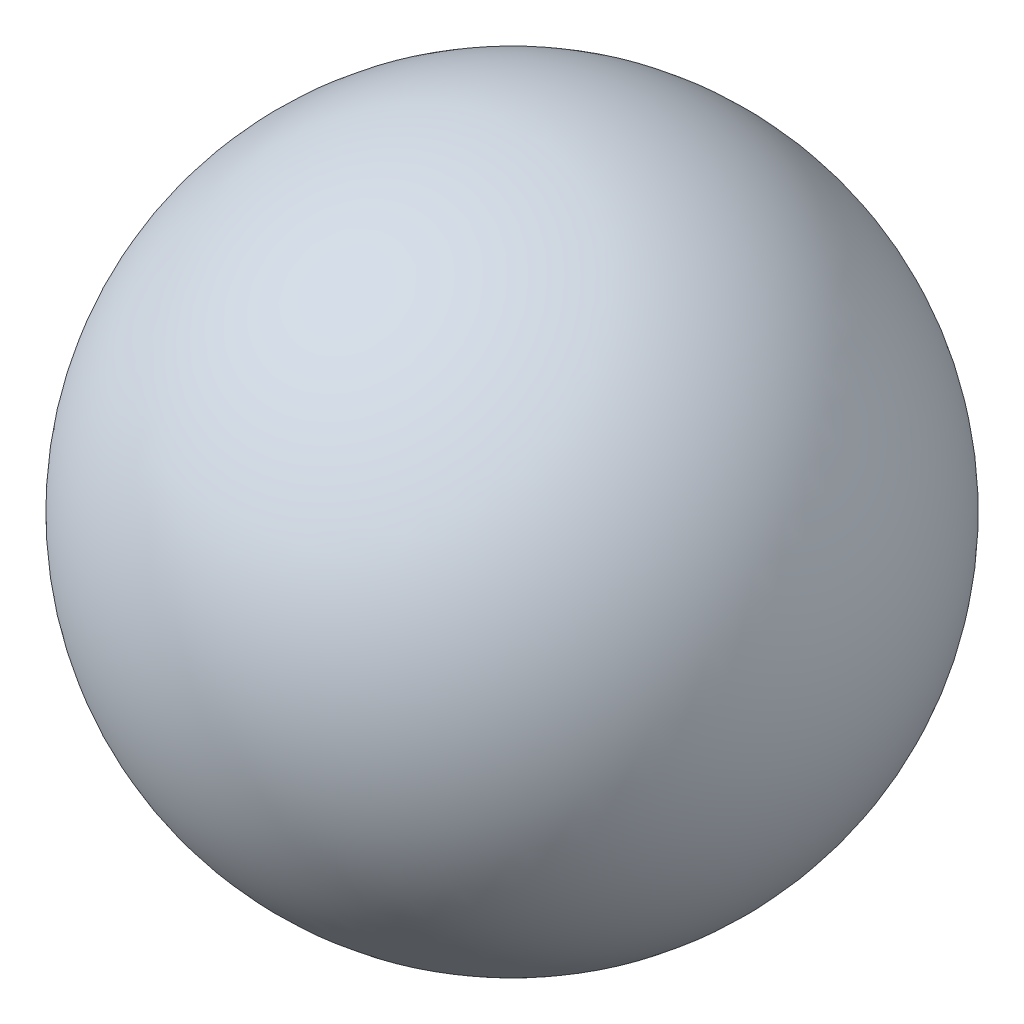
ISO-10303-21;
HEADER;
FILE_DESCRIPTION(('STEP AP214'),'2;1');
FILE_NAME('part.step','',(''),(''),'','','');
FILE_SCHEMA(('AUTOMOTIVE_DESIGN { 1 0 10303 214 1 1 1 1 }'));
ENDSEC;
DATA;
#1=APPLICATION_CONTEXT('core data for automotive mechanical design processes');
#2=APPLICATION_PROTOCOL_DEFINITION('international standard','automotive_design',2000,#1);
#3=PRODUCT_CONTEXT('',#1,'mechanical');
#4=PRODUCT('Part','Part','',(#3));
#5=PRODUCT_RELATED_PRODUCT_CATEGORY('part','',(#4));
#6=PRODUCT_DEFINITION_FORMATION('','',#4);
#7=PRODUCT_DEFINITION_CONTEXT('part definition',#1,'design');
#8=PRODUCT_DEFINITION('design','',#6,#7);
#9=PRODUCT_DEFINITION_SHAPE('','',#8);
#10=(LENGTH_UNIT() NAMED_UNIT(*) SI_UNIT(.MILLI.,.METRE.));
#11=(NAMED_UNIT(*) PLANE_ANGLE_UNIT() SI_UNIT($,.RADIAN.));
#12=(NAMED_UNIT(*) SI_UNIT($,.STERADIAN.) SOLID_ANGLE_UNIT());
#13=UNCERTAINTY_MEASURE_WITH_UNIT(LENGTH_MEASURE(1.E-05),#10,'distance_accuracy_value','');
#14=(GEOMETRIC_REPRESENTATION_CONTEXT(3) GLOBAL_UNCERTAINTY_ASSIGNED_CONTEXT((#13)) GLOBAL_UNIT_ASSIGNED_CONTEXT((#10,
#11,#12)) REPRESENTATION_CONTEXT('',''));
#15=CARTESIAN_POINT('',(0.,0.,0.));
#16=DIRECTION('',(0.,0.,1.));
#17=DIRECTION('',(1.,0.,0.));
#18=AXIS2_PLACEMENT_3D('',#15,#16,#17);
#19=CARTESIAN_POINT('',(0.,22.,0.));
#20=DIRECTION('',(0.,1.,0.));
#21=DIRECTION('',(1.,0.,0.));
#22=AXIS2_PLACEMENT_3D('',#19,#20,#21);
#23=SPHERICAL_SURFACE('',#22,22.);
#24=CARTESIAN_POINT('',(0.,44.,0.));
#25=VERTEX_POINT('',#24);
#26=VERTEX_LOOP('',#25);
#27=FACE_BOUND('',#26,.T.);
#28=ADVANCED_FACE('F29',(#27),#23,.T.);
#29=CLOSED_SHELL('',(#28));
#30=MANIFOLD_SOLID_BREP('B2',#29);
#31=ADVANCED_BREP_SHAPE_REPRESENTATION('',(#18,#30),#14);
#32=SHAPE_DEFINITION_REPRESENTATION(#9,#31);
ENDSEC;
END-ISO-10303-21;
